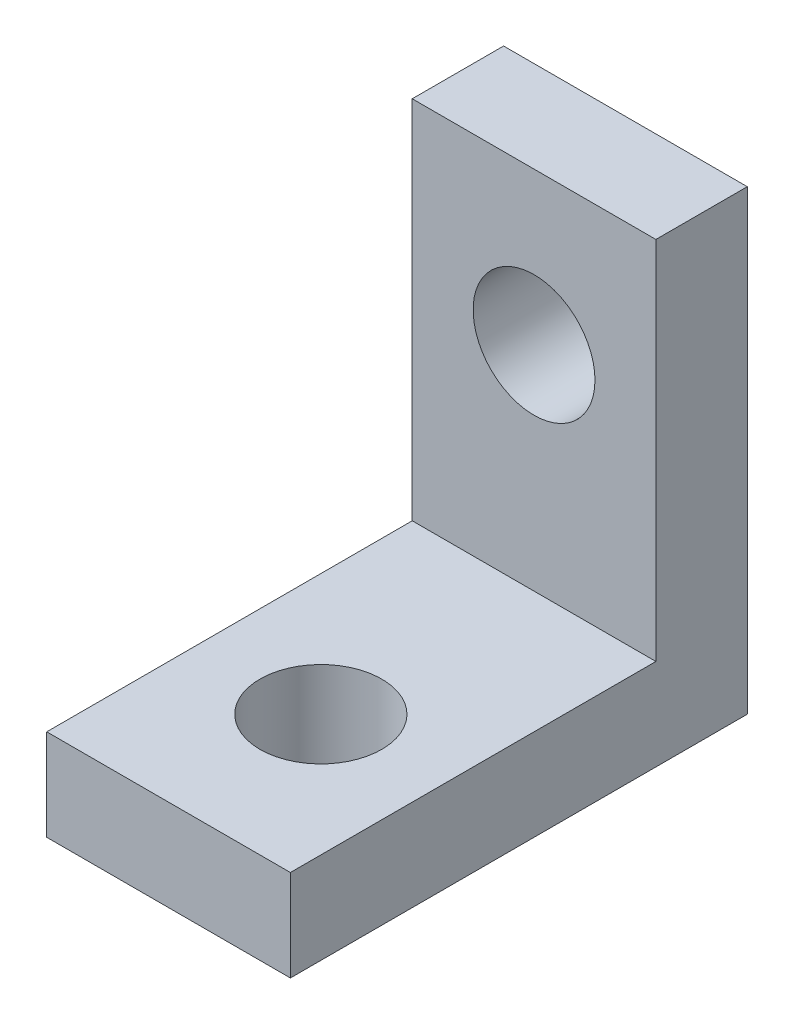
ISO-10303-21;
HEADER;
FILE_DESCRIPTION(('STEP AP214'),'2;1');
FILE_NAME('part.step','',(''),(''),'','','');
FILE_SCHEMA(('AUTOMOTIVE_DESIGN { 1 0 10303 214 1 1 1 1 }'));
ENDSEC;
DATA;
#1=APPLICATION_CONTEXT('core data for automotive mechanical design processes');
#2=APPLICATION_PROTOCOL_DEFINITION('international standard','automotive_design',2000,#1);
#3=PRODUCT_CONTEXT('',#1,'mechanical');
#4=PRODUCT('Part','Part','',(#3));
#5=PRODUCT_RELATED_PRODUCT_CATEGORY('part','',(#4));
#6=PRODUCT_DEFINITION_FORMATION('','',#4);
#7=PRODUCT_DEFINITION_CONTEXT('part definition',#1,'design');
#8=PRODUCT_DEFINITION('design','',#6,#7);
#9=PRODUCT_DEFINITION_SHAPE('','',#8);
#10=(LENGTH_UNIT() NAMED_UNIT(*) SI_UNIT(.MILLI.,.METRE.));
#11=(NAMED_UNIT(*) PLANE_ANGLE_UNIT() SI_UNIT($,.RADIAN.));
#12=(NAMED_UNIT(*) SI_UNIT($,.STERADIAN.) SOLID_ANGLE_UNIT());
#13=UNCERTAINTY_MEASURE_WITH_UNIT(LENGTH_MEASURE(1.E-05),#10,'distance_accuracy_value','');
#14=(GEOMETRIC_REPRESENTATION_CONTEXT(3) GLOBAL_UNCERTAINTY_ASSIGNED_CONTEXT((#13)) GLOBAL_UNIT_ASSIGNED_CONTEXT((#10,
#11,#12)) REPRESENTATION_CONTEXT('',''));
#15=CARTESIAN_POINT('',(0.,0.,0.));
#16=DIRECTION('',(0.,0.,1.));
#17=DIRECTION('',(1.,0.,0.));
#18=AXIS2_PLACEMENT_3D('',#15,#16,#17);
#19=CARTESIAN_POINT('',(-4.,1.5,15.));
#20=DIRECTION('',(0.,-1.,0.));
#21=DIRECTION('',(0.,0.,-1.));
#22=AXIS2_PLACEMENT_3D('',#19,#20,#21);
#23=PLANE('',#22);
#24=CARTESIAN_POINT('',(0.,1.5,10.));
#25=DIRECTION('',(0.,1.,0.));
#26=DIRECTION('',(0.,0.,1.));
#27=AXIS2_PLACEMENT_3D('',#24,#25,#26);
#28=CIRCLE('',#27,2.);
#29=CARTESIAN_POINT('',(0.,1.5,12.));
#30=VERTEX_POINT('',#29);
#31=EDGE_CURVE('E143',#30,#30,#28,.T.);
#32=ORIENTED_EDGE('',*,*,#31,.F.);
#33=EDGE_LOOP('',(#32));
#34=FACE_BOUND('',#33,.T.);
#35=DIRECTION('',(1.,0.,0.));
#36=VECTOR('',#35,1.);
#37=CARTESIAN_POINT('',(-4.,1.5,3.));
#38=LINE('',#37,#36);
#39=CARTESIAN_POINT('',(-4.,1.5,3.));
#40=VERTEX_POINT('',#39);
#41=CARTESIAN_POINT('',(4.,1.5,3.));
#42=VERTEX_POINT('',#41);
#43=EDGE_CURVE('E46',#40,#42,#38,.T.);
#44=ORIENTED_EDGE('',*,*,#43,.F.);
#45=DIRECTION('',(0.,0.,-1.));
#46=VECTOR('',#45,1.);
#47=CARTESIAN_POINT('',(-4.,1.5,15.));
#48=LINE('',#47,#46);
#49=CARTESIAN_POINT('',(-4.,1.5,15.));
#50=VERTEX_POINT('',#49);
#51=EDGE_CURVE('E40',#50,#40,#48,.T.);
#52=ORIENTED_EDGE('',*,*,#51,.F.);
#53=DIRECTION('',(-1.,0.,0.));
#54=VECTOR('',#53,1.);
#55=CARTESIAN_POINT('',(-4.,1.5,15.));
#56=LINE('',#55,#54);
#57=CARTESIAN_POINT('',(4.,1.5,15.));
#58=VERTEX_POINT('',#57);
#59=EDGE_CURVE('E75',#58,#50,#56,.T.);
#60=ORIENTED_EDGE('',*,*,#59,.F.);
#61=DIRECTION('',(0.,0.,-1.));
#62=VECTOR('',#61,1.);
#63=CARTESIAN_POINT('',(4.,1.5,15.));
#64=LINE('',#63,#62);
#65=EDGE_CURVE('E11',#58,#42,#64,.T.);
#66=ORIENTED_EDGE('',*,*,#65,.T.);
#67=EDGE_LOOP('',(#44,#52,#60,#66));
#68=FACE_BOUND('',#67,.T.);
#69=ADVANCED_FACE('F32',(#34,#68),#23,.F.);
#70=CARTESIAN_POINT('',(4.,1.5,15.));
#71=DIRECTION('',(-1.,0.,0.));
#72=DIRECTION('',(0.,-1.,0.));
#73=AXIS2_PLACEMENT_3D('',#70,#71,#72);
#74=PLANE('',#73);
#75=DIRECTION('',(0.,1.,0.));
#76=VECTOR('',#75,1.);
#77=CARTESIAN_POINT('',(4.,1.5,0.));
#78=LINE('',#77,#76);
#79=CARTESIAN_POINT('',(4.,-1.5,0.));
#80=VERTEX_POINT('',#79);
#81=CARTESIAN_POINT('',(4.,13.5,0.));
#82=VERTEX_POINT('',#81);
#83=EDGE_CURVE('E114',#80,#82,#78,.T.);
#84=ORIENTED_EDGE('',*,*,#83,.T.);
#85=DIRECTION('',(0.,0.,-1.));
#86=VECTOR('',#85,1.);
#87=CARTESIAN_POINT('',(4.,13.5,0.));
#88=LINE('',#87,#86);
#89=CARTESIAN_POINT('',(4.,13.5,3.));
#90=VERTEX_POINT('',#89);
#91=EDGE_CURVE('E102',#90,#82,#88,.T.);
#92=ORIENTED_EDGE('',*,*,#91,.F.);
#93=DIRECTION('',(0.,-1.,0.));
#94=VECTOR('',#93,1.);
#95=CARTESIAN_POINT('',(4.,13.5,3.));
#96=LINE('',#95,#94);
#97=EDGE_CURVE('E98',#90,#42,#96,.T.);
#98=ORIENTED_EDGE('',*,*,#97,.T.);
#99=ORIENTED_EDGE('',*,*,#65,.F.);
#100=DIRECTION('',(0.,1.,0.));
#101=VECTOR('',#100,1.);
#102=CARTESIAN_POINT('',(4.,1.5,15.));
#103=LINE('',#102,#101);
#104=CARTESIAN_POINT('',(4.,-1.5,15.));
#105=VERTEX_POINT('',#104);
#106=EDGE_CURVE('E121',#105,#58,#103,.T.);
#107=ORIENTED_EDGE('',*,*,#106,.F.);
#108=DIRECTION('',(0.,0.,-1.));
#109=VECTOR('',#108,1.);
#110=CARTESIAN_POINT('',(4.,-1.5,15.));
#111=LINE('',#110,#109);
#112=EDGE_CURVE('E126',#105,#80,#111,.T.);
#113=ORIENTED_EDGE('',*,*,#112,.T.);
#114=EDGE_LOOP('',(#84,#92,#98,#99,#107,#113));
#115=FACE_BOUND('',#114,.T.);
#116=ADVANCED_FACE('F34',(#115),#74,.F.);
#117=CARTESIAN_POINT('',(-4.,1.5,15.));
#118=DIRECTION('',(1.,0.,0.));
#119=DIRECTION('',(0.,1.,0.));
#120=AXIS2_PLACEMENT_3D('',#117,#118,#119);
#121=PLANE('',#120);
#122=DIRECTION('',(0.,-1.,0.));
#123=VECTOR('',#122,1.);
#124=CARTESIAN_POINT('',(-4.,1.5,0.));
#125=LINE('',#124,#123);
#126=CARTESIAN_POINT('',(-4.,13.5,0.));
#127=VERTEX_POINT('',#126);
#128=CARTESIAN_POINT('',(-4.,-1.5,0.));
#129=VERTEX_POINT('',#128);
#130=EDGE_CURVE('E116',#127,#129,#125,.T.);
#131=ORIENTED_EDGE('',*,*,#130,.T.);
#132=DIRECTION('',(0.,0.,-1.));
#133=VECTOR('',#132,1.);
#134=CARTESIAN_POINT('',(-4.,-1.5,15.));
#135=LINE('',#134,#133);
#136=CARTESIAN_POINT('',(-4.,-1.5,15.));
#137=VERTEX_POINT('',#136);
#138=EDGE_CURVE('E131',#137,#129,#135,.T.);
#139=ORIENTED_EDGE('',*,*,#138,.F.);
#140=DIRECTION('',(0.,-1.,0.));
#141=VECTOR('',#140,1.);
#142=CARTESIAN_POINT('',(-4.,1.5,15.));
#143=LINE('',#142,#141);
#144=EDGE_CURVE('E124',#50,#137,#143,.T.);
#145=ORIENTED_EDGE('',*,*,#144,.F.);
#146=ORIENTED_EDGE('',*,*,#51,.T.);
#147=DIRECTION('',(0.,-1.,0.));
#148=VECTOR('',#147,1.);
#149=CARTESIAN_POINT('',(-4.,13.5,3.));
#150=LINE('',#149,#148);
#151=CARTESIAN_POINT('',(-4.,13.5,3.));
#152=VERTEX_POINT('',#151);
#153=EDGE_CURVE('E96',#152,#40,#150,.T.);
#154=ORIENTED_EDGE('',*,*,#153,.F.);
#155=DIRECTION('',(0.,0.,1.));
#156=VECTOR('',#155,1.);
#157=CARTESIAN_POINT('',(-4.,13.5,0.));
#158=LINE('',#157,#156);
#159=EDGE_CURVE('E103',#127,#152,#158,.T.);
#160=ORIENTED_EDGE('',*,*,#159,.F.);
#161=EDGE_LOOP('',(#131,#139,#145,#146,#154,#160));
#162=FACE_BOUND('',#161,.T.);
#163=ADVANCED_FACE('F112',(#162),#121,.F.);
#164=CARTESIAN_POINT('',(-4.,-1.5,15.));
#165=DIRECTION('',(0.,1.,0.));
#166=DIRECTION('',(0.,0.,1.));
#167=AXIS2_PLACEMENT_3D('',#164,#165,#166);
#168=PLANE('',#167);
#169=CARTESIAN_POINT('',(0.,-1.5,10.));
#170=DIRECTION('',(0.,1.,0.));
#171=DIRECTION('',(0.,0.,1.));
#172=AXIS2_PLACEMENT_3D('',#169,#170,#171);
#173=CIRCLE('',#172,2.);
#174=CARTESIAN_POINT('',(0.,-1.5,12.));
#175=VERTEX_POINT('',#174);
#176=EDGE_CURVE('E141',#175,#175,#173,.T.);
#177=ORIENTED_EDGE('',*,*,#176,.T.);
#178=EDGE_LOOP('',(#177));
#179=FACE_BOUND('',#178,.T.);
#180=DIRECTION('',(1.,0.,0.));
#181=VECTOR('',#180,1.);
#182=CARTESIAN_POINT('',(-4.,-1.5,0.));
#183=LINE('',#182,#181);
#184=EDGE_CURVE('E70',#129,#80,#183,.T.);
#185=ORIENTED_EDGE('',*,*,#184,.T.);
#186=ORIENTED_EDGE('',*,*,#112,.F.);
#187=DIRECTION('',(1.,0.,0.));
#188=VECTOR('',#187,1.);
#189=CARTESIAN_POINT('',(-4.,-1.5,15.));
#190=LINE('',#189,#188);
#191=EDGE_CURVE('E55',#137,#105,#190,.T.);
#192=ORIENTED_EDGE('',*,*,#191,.F.);
#193=ORIENTED_EDGE('',*,*,#138,.T.);
#194=EDGE_LOOP('',(#185,#186,#192,#193));
#195=FACE_BOUND('',#194,.T.);
#196=ADVANCED_FACE('F133',(#179,#195),#168,.F.);
#197=CARTESIAN_POINT('',(0.,0.,15.));
#198=DIRECTION('',(0.,0.,1.));
#199=DIRECTION('',(1.,0.,0.));
#200=AXIS2_PLACEMENT_3D('',#197,#198,#199);
#201=PLANE('',#200);
#202=ORIENTED_EDGE('',*,*,#106,.T.);
#203=ORIENTED_EDGE('',*,*,#59,.T.);
#204=ORIENTED_EDGE('',*,*,#144,.T.);
#205=ORIENTED_EDGE('',*,*,#191,.T.);
#206=EDGE_LOOP('',(#202,#203,#204,#205));
#207=FACE_BOUND('',#206,.T.);
#208=ADVANCED_FACE('F172',(#207),#201,.T.);
#209=CARTESIAN_POINT('',(0.,0.,0.));
#210=DIRECTION('',(0.,0.,1.));
#211=DIRECTION('',(1.,0.,0.));
#212=AXIS2_PLACEMENT_3D('',#209,#210,#211);
#213=PLANE('',#212);
#214=CARTESIAN_POINT('',(0.,8.5,0.));
#215=DIRECTION('',(0.,0.,1.));
#216=DIRECTION('',(1.,0.,0.));
#217=AXIS2_PLACEMENT_3D('',#214,#215,#216);
#218=CIRCLE('',#217,2.);
#219=CARTESIAN_POINT('',(2.,8.5,0.));
#220=VERTEX_POINT('',#219);
#221=EDGE_CURVE('E148',#220,#220,#218,.T.);
#222=ORIENTED_EDGE('',*,*,#221,.T.);
#223=EDGE_LOOP('',(#222));
#224=FACE_BOUND('',#223,.T.);
#225=ORIENTED_EDGE('',*,*,#83,.F.);
#226=ORIENTED_EDGE('',*,*,#184,.F.);
#227=ORIENTED_EDGE('',*,*,#130,.F.);
#228=DIRECTION('',(-1.,0.,0.));
#229=VECTOR('',#228,1.);
#230=CARTESIAN_POINT('',(-4.,13.5,0.));
#231=LINE('',#230,#229);
#232=EDGE_CURVE('E109',#82,#127,#231,.T.);
#233=ORIENTED_EDGE('',*,*,#232,.F.);
#234=EDGE_LOOP('',(#225,#226,#227,#233));
#235=FACE_BOUND('',#234,.T.);
#236=ADVANCED_FACE('F136',(#224,#235),#213,.F.);
#237=CARTESIAN_POINT('',(-4.,13.5,3.));
#238=DIRECTION('',(0.,0.,-1.));
#239=DIRECTION('',(-1.,0.,0.));
#240=AXIS2_PLACEMENT_3D('',#237,#238,#239);
#241=PLANE('',#240);
#242=CARTESIAN_POINT('',(0.,8.5,3.));
#243=DIRECTION('',(0.,0.,1.));
#244=DIRECTION('',(1.,0.,0.));
#245=AXIS2_PLACEMENT_3D('',#242,#243,#244);
#246=CIRCLE('',#245,2.);
#247=CARTESIAN_POINT('',(2.,8.5,3.));
#248=VERTEX_POINT('',#247);
#249=EDGE_CURVE('E151',#248,#248,#246,.T.);
#250=ORIENTED_EDGE('',*,*,#249,.F.);
#251=EDGE_LOOP('',(#250));
#252=FACE_BOUND('',#251,.T.);
#253=ORIENTED_EDGE('',*,*,#43,.T.);
#254=ORIENTED_EDGE('',*,*,#97,.F.);
#255=DIRECTION('',(1.,0.,0.));
#256=VECTOR('',#255,1.);
#257=CARTESIAN_POINT('',(-4.,13.5,3.));
#258=LINE('',#257,#256);
#259=EDGE_CURVE('E92',#152,#90,#258,.T.);
#260=ORIENTED_EDGE('',*,*,#259,.F.);
#261=ORIENTED_EDGE('',*,*,#153,.T.);
#262=EDGE_LOOP('',(#253,#254,#260,#261));
#263=FACE_BOUND('',#262,.T.);
#264=ADVANCED_FACE('F94',(#252,#263),#241,.F.);
#265=CARTESIAN_POINT('',(0.,13.5,0.));
#266=DIRECTION('',(0.,1.,0.));
#267=DIRECTION('',(0.,0.,1.));
#268=AXIS2_PLACEMENT_3D('',#265,#266,#267);
#269=PLANE('',#268);
#270=ORIENTED_EDGE('',*,*,#159,.T.);
#271=ORIENTED_EDGE('',*,*,#259,.T.);
#272=ORIENTED_EDGE('',*,*,#91,.T.);
#273=ORIENTED_EDGE('',*,*,#232,.T.);
#274=EDGE_LOOP('',(#270,#271,#272,#273));
#275=FACE_BOUND('',#274,.T.);
#276=ADVANCED_FACE('F107',(#275),#269,.T.);
#277=CARTESIAN_POINT('',(0.,-1.5,10.));
#278=DIRECTION('',(0.,1.,0.));
#279=DIRECTION('',(0.,0.,1.));
#280=AXIS2_PLACEMENT_3D('',#277,#278,#279);
#281=CYLINDRICAL_SURFACE('',#280,2.);
#282=ORIENTED_EDGE('',*,*,#176,.F.);
#283=EDGE_LOOP('',(#282));
#284=FACE_BOUND('',#283,.T.);
#285=ORIENTED_EDGE('',*,*,#31,.T.);
#286=EDGE_LOOP('',(#285));
#287=FACE_BOUND('',#286,.T.);
#288=ADVANCED_FACE('F161',(#284,#287),#281,.F.);
#289=CARTESIAN_POINT('',(0.,8.5,0.));
#290=DIRECTION('',(0.,0.,1.));
#291=DIRECTION('',(1.,0.,0.));
#292=AXIS2_PLACEMENT_3D('',#289,#290,#291);
#293=CYLINDRICAL_SURFACE('',#292,2.);
#294=ORIENTED_EDGE('',*,*,#221,.F.);
#295=EDGE_LOOP('',(#294));
#296=FACE_BOUND('',#295,.T.);
#297=ORIENTED_EDGE('',*,*,#249,.T.);
#298=EDGE_LOOP('',(#297));
#299=FACE_BOUND('',#298,.T.);
#300=ADVANCED_FACE('F158',(#296,#299),#293,.F.);
#301=CLOSED_SHELL('',(#69,#116,#163,#196,#208,#236,#264,#276,#288,#300));
#302=MANIFOLD_SOLID_BREP('B2',#301);
#303=ADVANCED_BREP_SHAPE_REPRESENTATION('',(#18,#302),#14);
#304=SHAPE_DEFINITION_REPRESENTATION(#9,#303);
ENDSEC;
END-ISO-10303-21;
